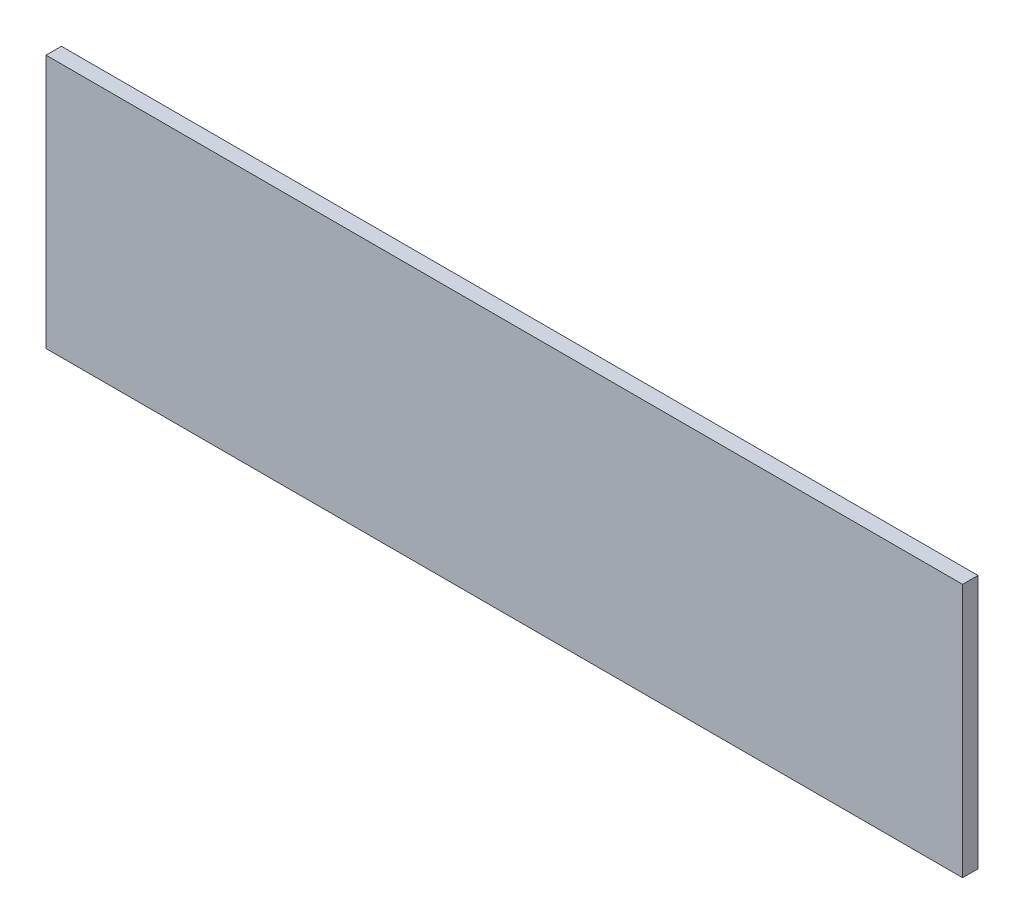
ISO-10303-21;
HEADER;
FILE_DESCRIPTION(('STEP AP214'),'2;1');
FILE_NAME('part.step','',(''),(''),'','','');
FILE_SCHEMA(('AUTOMOTIVE_DESIGN { 1 0 10303 214 1 1 1 1 }'));
ENDSEC;
DATA;
#1=APPLICATION_CONTEXT('core data for automotive mechanical design processes');
#2=APPLICATION_PROTOCOL_DEFINITION('international standard','automotive_design',2000,#1);
#3=PRODUCT_CONTEXT('',#1,'mechanical');
#4=PRODUCT('Part','Part','',(#3));
#5=PRODUCT_RELATED_PRODUCT_CATEGORY('part','',(#4));
#6=PRODUCT_DEFINITION_FORMATION('','',#4);
#7=PRODUCT_DEFINITION_CONTEXT('part definition',#1,'design');
#8=PRODUCT_DEFINITION('design','',#6,#7);
#9=PRODUCT_DEFINITION_SHAPE('','',#8);
#10=(LENGTH_UNIT() NAMED_UNIT(*) SI_UNIT(.MILLI.,.METRE.));
#11=(NAMED_UNIT(*) PLANE_ANGLE_UNIT() SI_UNIT($,.RADIAN.));
#12=(NAMED_UNIT(*) SI_UNIT($,.STERADIAN.) SOLID_ANGLE_UNIT());
#13=UNCERTAINTY_MEASURE_WITH_UNIT(LENGTH_MEASURE(1.E-05),#10,'distance_accuracy_value','');
#14=(GEOMETRIC_REPRESENTATION_CONTEXT(3) GLOBAL_UNCERTAINTY_ASSIGNED_CONTEXT((#13)) GLOBAL_UNIT_ASSIGNED_CONTEXT((#10,
#11,#12)) REPRESENTATION_CONTEXT('',''));
#15=CARTESIAN_POINT('',(0.,0.,0.));
#16=DIRECTION('',(0.,0.,1.));
#17=DIRECTION('',(1.,0.,0.));
#18=AXIS2_PLACEMENT_3D('',#15,#16,#17);
#19=CARTESIAN_POINT('',(148.75,-41.235,5.));
#20=DIRECTION('',(-1.,0.,0.));
#21=DIRECTION('',(0.,0.,1.));
#22=AXIS2_PLACEMENT_3D('',#19,#20,#21);
#23=PLANE('',#22);
#24=DIRECTION('',(0.,1.,0.));
#25=VECTOR('',#24,1.);
#26=CARTESIAN_POINT('',(148.75,-41.235,0.));
#27=LINE('',#26,#25);
#28=CARTESIAN_POINT('',(148.75,-41.235,0.));
#29=VERTEX_POINT('',#28);
#30=CARTESIAN_POINT('',(148.75,41.235,0.));
#31=VERTEX_POINT('',#30);
#32=EDGE_CURVE('E96',#29,#31,#27,.T.);
#33=ORIENTED_EDGE('',*,*,#32,.T.);
#34=DIRECTION('',(0.,0.,-1.));
#35=VECTOR('',#34,1.);
#36=CARTESIAN_POINT('',(148.75,41.235,5.));
#37=LINE('',#36,#35);
#38=CARTESIAN_POINT('',(148.75,41.235,5.));
#39=VERTEX_POINT('',#38);
#40=EDGE_CURVE('E11',#39,#31,#37,.T.);
#41=ORIENTED_EDGE('',*,*,#40,.F.);
#42=DIRECTION('',(0.,1.,0.));
#43=VECTOR('',#42,1.);
#44=CARTESIAN_POINT('',(148.75,-41.235,5.));
#45=LINE('',#44,#43);
#46=CARTESIAN_POINT('',(148.75,-41.235,5.));
#47=VERTEX_POINT('',#46);
#48=EDGE_CURVE('E84',#47,#39,#45,.T.);
#49=ORIENTED_EDGE('',*,*,#48,.F.);
#50=DIRECTION('',(0.,0.,-1.));
#51=VECTOR('',#50,1.);
#52=CARTESIAN_POINT('',(148.75,-41.235,5.));
#53=LINE('',#52,#51);
#54=EDGE_CURVE('E92',#47,#29,#53,.T.);
#55=ORIENTED_EDGE('',*,*,#54,.T.);
#56=EDGE_LOOP('',(#33,#41,#49,#55));
#57=FACE_BOUND('',#56,.T.);
#58=ADVANCED_FACE('F33',(#57),#23,.F.);
#59=CARTESIAN_POINT('',(-148.75,41.235,5.));
#60=DIRECTION('',(0.,-1.,0.));
#61=DIRECTION('',(0.,0.,-1.));
#62=AXIS2_PLACEMENT_3D('',#59,#60,#61);
#63=PLANE('',#62);
#64=DIRECTION('',(-1.,0.,0.));
#65=VECTOR('',#64,1.);
#66=CARTESIAN_POINT('',(-148.75,41.235,0.));
#67=LINE('',#66,#65);
#68=CARTESIAN_POINT('',(-148.75,41.235,0.));
#69=VERTEX_POINT('',#68);
#70=EDGE_CURVE('E88',#31,#69,#67,.T.);
#71=ORIENTED_EDGE('',*,*,#70,.T.);
#72=DIRECTION('',(0.,0.,-1.));
#73=VECTOR('',#72,1.);
#74=CARTESIAN_POINT('',(-148.75,41.235,5.));
#75=LINE('',#74,#73);
#76=CARTESIAN_POINT('',(-148.75,41.235,5.));
#77=VERTEX_POINT('',#76);
#78=EDGE_CURVE('E41',#77,#69,#75,.T.);
#79=ORIENTED_EDGE('',*,*,#78,.F.);
#80=DIRECTION('',(-1.,0.,0.));
#81=VECTOR('',#80,1.);
#82=CARTESIAN_POINT('',(-148.75,41.235,5.));
#83=LINE('',#82,#81);
#84=EDGE_CURVE('E79',#39,#77,#83,.T.);
#85=ORIENTED_EDGE('',*,*,#84,.F.);
#86=ORIENTED_EDGE('',*,*,#40,.T.);
#87=EDGE_LOOP('',(#71,#79,#85,#86));
#88=FACE_BOUND('',#87,.T.);
#89=ADVANCED_FACE('F87',(#88),#63,.F.);
#90=CARTESIAN_POINT('',(-148.75,-41.235,5.));
#91=DIRECTION('',(1.,0.,0.));
#92=DIRECTION('',(0.,0.,-1.));
#93=AXIS2_PLACEMENT_3D('',#90,#91,#92);
#94=PLANE('',#93);
#95=DIRECTION('',(0.,-1.,0.));
#96=VECTOR('',#95,1.);
#97=CARTESIAN_POINT('',(-148.75,-41.235,0.));
#98=LINE('',#97,#96);
#99=CARTESIAN_POINT('',(-148.75,-41.235,0.));
#100=VERTEX_POINT('',#99);
#101=EDGE_CURVE('E66',#69,#100,#98,.T.);
#102=ORIENTED_EDGE('',*,*,#101,.T.);
#103=DIRECTION('',(0.,0.,-1.));
#104=VECTOR('',#103,1.);
#105=CARTESIAN_POINT('',(-148.75,-41.235,5.));
#106=LINE('',#105,#104);
#107=CARTESIAN_POINT('',(-148.75,-41.235,5.));
#108=VERTEX_POINT('',#107);
#109=EDGE_CURVE('E89',#108,#100,#106,.T.);
#110=ORIENTED_EDGE('',*,*,#109,.F.);
#111=DIRECTION('',(0.,-1.,0.));
#112=VECTOR('',#111,1.);
#113=CARTESIAN_POINT('',(-148.75,-41.235,5.));
#114=LINE('',#113,#112);
#115=EDGE_CURVE('E82',#77,#108,#114,.T.);
#116=ORIENTED_EDGE('',*,*,#115,.F.);
#117=ORIENTED_EDGE('',*,*,#78,.T.);
#118=EDGE_LOOP('',(#102,#110,#116,#117));
#119=FACE_BOUND('',#118,.T.);
#120=ADVANCED_FACE('F90',(#119),#94,.F.);
#121=CARTESIAN_POINT('',(-148.75,-41.235,5.));
#122=DIRECTION('',(0.,1.,0.));
#123=DIRECTION('',(0.,0.,1.));
#124=AXIS2_PLACEMENT_3D('',#121,#122,#123);
#125=PLANE('',#124);
#126=DIRECTION('',(1.,0.,0.));
#127=VECTOR('',#126,1.);
#128=CARTESIAN_POINT('',(-148.75,-41.235,0.));
#129=LINE('',#128,#127);
#130=EDGE_CURVE('E72',#100,#29,#129,.T.);
#131=ORIENTED_EDGE('',*,*,#130,.T.);
#132=ORIENTED_EDGE('',*,*,#54,.F.);
#133=DIRECTION('',(1.,0.,0.));
#134=VECTOR('',#133,1.);
#135=CARTESIAN_POINT('',(-148.75,-41.235,5.));
#136=LINE('',#135,#134);
#137=EDGE_CURVE('E49',#108,#47,#136,.T.);
#138=ORIENTED_EDGE('',*,*,#137,.F.);
#139=ORIENTED_EDGE('',*,*,#109,.T.);
#140=EDGE_LOOP('',(#131,#132,#138,#139));
#141=FACE_BOUND('',#140,.T.);
#142=ADVANCED_FACE('F103',(#141),#125,.F.);
#143=CARTESIAN_POINT('',(0.,0.,5.));
#144=DIRECTION('',(0.,0.,-1.));
#145=DIRECTION('',(-1.,0.,0.));
#146=AXIS2_PLACEMENT_3D('',#143,#144,#145);
#147=PLANE('',#146);
#148=ORIENTED_EDGE('',*,*,#48,.T.);
#149=ORIENTED_EDGE('',*,*,#84,.T.);
#150=ORIENTED_EDGE('',*,*,#115,.T.);
#151=ORIENTED_EDGE('',*,*,#137,.T.);
#152=EDGE_LOOP('',(#148,#149,#150,#151));
#153=FACE_BOUND('',#152,.T.);
#154=ADVANCED_FACE('F80',(#153),#147,.F.);
#155=CARTESIAN_POINT('',(0.,0.,0.));
#156=DIRECTION('',(0.,0.,-1.));
#157=DIRECTION('',(-1.,0.,0.));
#158=AXIS2_PLACEMENT_3D('',#155,#156,#157);
#159=PLANE('',#158);
#160=ORIENTED_EDGE('',*,*,#32,.F.);
#161=ORIENTED_EDGE('',*,*,#130,.F.);
#162=ORIENTED_EDGE('',*,*,#101,.F.);
#163=ORIENTED_EDGE('',*,*,#70,.F.);
#164=EDGE_LOOP('',(#160,#161,#162,#163));
#165=FACE_BOUND('',#164,.T.);
#166=ADVANCED_FACE('F106',(#165),#159,.T.);
#167=CLOSED_SHELL('',(#58,#89,#120,#142,#154,#166));
#168=MANIFOLD_SOLID_BREP('B2',#167);
#169=ADVANCED_BREP_SHAPE_REPRESENTATION('',(#18,#168),#14);
#170=SHAPE_DEFINITION_REPRESENTATION(#9,#169);
ENDSEC;
END-ISO-10303-21;
